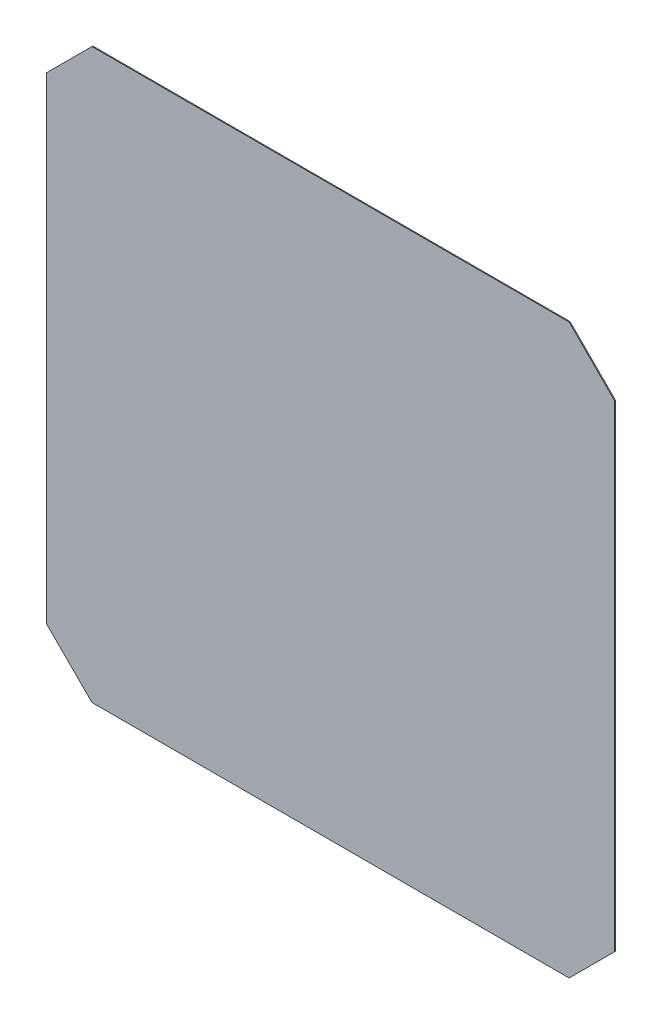
ISO-10303-21;
HEADER;
FILE_DESCRIPTION(('STEP AP214'),'2;1');
FILE_NAME('part.step','',(''),(''),'','','');
FILE_SCHEMA(('AUTOMOTIVE_DESIGN { 1 0 10303 214 1 1 1 1 }'));
ENDSEC;
DATA;
#1=APPLICATION_CONTEXT('core data for automotive mechanical design processes');
#2=APPLICATION_PROTOCOL_DEFINITION('international standard','automotive_design',2000,#1);
#3=PRODUCT_CONTEXT('',#1,'mechanical');
#4=PRODUCT('Part','Part','',(#3));
#5=PRODUCT_RELATED_PRODUCT_CATEGORY('part','',(#4));
#6=PRODUCT_DEFINITION_FORMATION('','',#4);
#7=PRODUCT_DEFINITION_CONTEXT('part definition',#1,'design');
#8=PRODUCT_DEFINITION('design','',#6,#7);
#9=PRODUCT_DEFINITION_SHAPE('','',#8);
#10=(LENGTH_UNIT() NAMED_UNIT(*) SI_UNIT(.MILLI.,.METRE.));
#11=(NAMED_UNIT(*) PLANE_ANGLE_UNIT() SI_UNIT($,.RADIAN.));
#12=(NAMED_UNIT(*) SI_UNIT($,.STERADIAN.) SOLID_ANGLE_UNIT());
#13=UNCERTAINTY_MEASURE_WITH_UNIT(LENGTH_MEASURE(1.E-05),#10,'distance_accuracy_value','');
#14=(GEOMETRIC_REPRESENTATION_CONTEXT(3) GLOBAL_UNCERTAINTY_ASSIGNED_CONTEXT((#13)) GLOBAL_UNIT_ASSIGNED_CONTEXT((#10,
#11,#12)) REPRESENTATION_CONTEXT('',''));
#15=CARTESIAN_POINT('',(0.,0.,0.));
#16=DIRECTION('',(0.,0.,1.));
#17=DIRECTION('',(1.,0.,0.));
#18=AXIS2_PLACEMENT_3D('',#15,#16,#17);
#19=CARTESIAN_POINT('',(-52.5,62.5,0.2));
#20=DIRECTION('',(0.,-1.,0.));
#21=DIRECTION('',(0.,0.,-1.));
#22=AXIS2_PLACEMENT_3D('',#19,#20,#21);
#23=PLANE('',#22);
#24=DIRECTION('',(-1.,0.,0.));
#25=VECTOR('',#24,1.);
#26=CARTESIAN_POINT('',(-52.5,62.5,0.));
#27=LINE('',#26,#25);
#28=CARTESIAN_POINT('',(52.5,62.5,0.));
#29=VERTEX_POINT('',#28);
#30=CARTESIAN_POINT('',(-52.5,62.5,0.));
#31=VERTEX_POINT('',#30);
#32=EDGE_CURVE('E150',#29,#31,#27,.T.);
#33=ORIENTED_EDGE('',*,*,#32,.T.);
#34=DIRECTION('',(0.,0.,-1.));
#35=VECTOR('',#34,1.);
#36=CARTESIAN_POINT('',(-52.5,62.5,0.2));
#37=LINE('',#36,#35);
#38=CARTESIAN_POINT('',(-52.5,62.5,0.2));
#39=VERTEX_POINT('',#38);
#40=EDGE_CURVE('E11',#39,#31,#37,.T.);
#41=ORIENTED_EDGE('',*,*,#40,.F.);
#42=DIRECTION('',(-1.,0.,0.));
#43=VECTOR('',#42,1.);
#44=CARTESIAN_POINT('',(-52.5,62.5,0.2));
#45=LINE('',#44,#43);
#46=CARTESIAN_POINT('',(52.5,62.5,0.2));
#47=VERTEX_POINT('',#46);
#48=EDGE_CURVE('E172',#47,#39,#45,.T.);
#49=ORIENTED_EDGE('',*,*,#48,.F.);
#50=DIRECTION('',(0.,0.,-1.));
#51=VECTOR('',#50,1.);
#52=CARTESIAN_POINT('',(52.5,62.5,0.2));
#53=LINE('',#52,#51);
#54=EDGE_CURVE('E146',#47,#29,#53,.T.);
#55=ORIENTED_EDGE('',*,*,#54,.T.);
#56=EDGE_LOOP('',(#33,#41,#49,#55));
#57=FACE_BOUND('',#56,.T.);
#58=ADVANCED_FACE('F49',(#57),#23,.F.);
#59=CARTESIAN_POINT('',(-62.5,52.5,0.2));
#60=DIRECTION('',(0.707106781186548,-0.707106781186548,0.));
#61=DIRECTION('',(0.707106781186548,0.707106781186548,0.));
#62=AXIS2_PLACEMENT_3D('',#59,#60,#61);
#63=PLANE('',#62);
#64=DIRECTION('',(-0.707106781186548,-0.707106781186548,0.));
#65=VECTOR('',#64,1.);
#66=CARTESIAN_POINT('',(-62.5,52.5,0.));
#67=LINE('',#66,#65);
#68=CARTESIAN_POINT('',(-62.5,52.5,0.));
#69=VERTEX_POINT('',#68);
#70=EDGE_CURVE('E154',#31,#69,#67,.T.);
#71=ORIENTED_EDGE('',*,*,#70,.T.);
#72=DIRECTION('',(0.,0.,-1.));
#73=VECTOR('',#72,1.);
#74=CARTESIAN_POINT('',(-62.5,52.5,0.2));
#75=LINE('',#74,#73);
#76=CARTESIAN_POINT('',(-62.5,52.5,0.2));
#77=VERTEX_POINT('',#76);
#78=EDGE_CURVE('E58',#77,#69,#75,.T.);
#79=ORIENTED_EDGE('',*,*,#78,.F.);
#80=DIRECTION('',(-0.707106781186548,-0.707106781186548,0.));
#81=VECTOR('',#80,1.);
#82=CARTESIAN_POINT('',(-62.5,52.5,0.2));
#83=LINE('',#82,#81);
#84=EDGE_CURVE('E109',#39,#77,#83,.T.);
#85=ORIENTED_EDGE('',*,*,#84,.F.);
#86=ORIENTED_EDGE('',*,*,#40,.T.);
#87=EDGE_LOOP('',(#71,#79,#85,#86));
#88=FACE_BOUND('',#87,.T.);
#89=ADVANCED_FACE('F218',(#88),#63,.F.);
#90=CARTESIAN_POINT('',(-62.5,52.5,0.2));
#91=DIRECTION('',(1.,0.,0.));
#92=DIRECTION('',(0.,0.,-1.));
#93=AXIS2_PLACEMENT_3D('',#90,#91,#92);
#94=PLANE('',#93);
#95=DIRECTION('',(0.,-1.,0.));
#96=VECTOR('',#95,1.);
#97=CARTESIAN_POINT('',(-62.5,52.5,0.));
#98=LINE('',#97,#96);
#99=CARTESIAN_POINT('',(-62.5,-52.5,0.));
#100=VERTEX_POINT('',#99);
#101=EDGE_CURVE('E157',#69,#100,#98,.T.);
#102=ORIENTED_EDGE('',*,*,#101,.T.);
#103=DIRECTION('',(0.,0.,-1.));
#104=VECTOR('',#103,1.);
#105=CARTESIAN_POINT('',(-62.5,-52.5,0.2));
#106=LINE('',#105,#104);
#107=CARTESIAN_POINT('',(-62.5,-52.5,0.2));
#108=VERTEX_POINT('',#107);
#109=EDGE_CURVE('E183',#108,#100,#106,.T.);
#110=ORIENTED_EDGE('',*,*,#109,.F.);
#111=DIRECTION('',(0.,-1.,0.));
#112=VECTOR('',#111,1.);
#113=CARTESIAN_POINT('',(-62.5,52.5,0.2));
#114=LINE('',#113,#112);
#115=EDGE_CURVE('E193',#77,#108,#114,.T.);
#116=ORIENTED_EDGE('',*,*,#115,.F.);
#117=ORIENTED_EDGE('',*,*,#78,.T.);
#118=EDGE_LOOP('',(#102,#110,#116,#117));
#119=FACE_BOUND('',#118,.T.);
#120=ADVANCED_FACE('F191',(#119),#94,.F.);
#121=CARTESIAN_POINT('',(-62.5,-52.5,0.2));
#122=DIRECTION('',(0.707106781186548,0.707106781186548,0.));
#123=DIRECTION('',(-0.707106781186548,0.707106781186548,0.));
#124=AXIS2_PLACEMENT_3D('',#121,#122,#123);
#125=PLANE('',#124);
#126=DIRECTION('',(0.707106781186548,-0.707106781186548,0.));
#127=VECTOR('',#126,1.);
#128=CARTESIAN_POINT('',(-62.5,-52.5,0.));
#129=LINE('',#128,#127);
#130=CARTESIAN_POINT('',(-52.5,-62.5,0.));
#131=VERTEX_POINT('',#130);
#132=EDGE_CURVE('E160',#100,#131,#129,.T.);
#133=ORIENTED_EDGE('',*,*,#132,.T.);
#134=DIRECTION('',(0.,0.,-1.));
#135=VECTOR('',#134,1.);
#136=CARTESIAN_POINT('',(-52.5,-62.5,0.2));
#137=LINE('',#136,#135);
#138=CARTESIAN_POINT('',(-52.5,-62.5,0.2));
#139=VERTEX_POINT('',#138);
#140=EDGE_CURVE('E179',#139,#131,#137,.T.);
#141=ORIENTED_EDGE('',*,*,#140,.F.);
#142=DIRECTION('',(0.707106781186548,-0.707106781186548,0.));
#143=VECTOR('',#142,1.);
#144=CARTESIAN_POINT('',(-62.5,-52.5,0.2));
#145=LINE('',#144,#143);
#146=EDGE_CURVE('E206',#108,#139,#145,.T.);
#147=ORIENTED_EDGE('',*,*,#146,.F.);
#148=ORIENTED_EDGE('',*,*,#109,.T.);
#149=EDGE_LOOP('',(#133,#141,#147,#148));
#150=FACE_BOUND('',#149,.T.);
#151=ADVANCED_FACE('F201',(#150),#125,.F.);
#152=CARTESIAN_POINT('',(-52.5,-62.5,0.2));
#153=DIRECTION('',(0.,1.,0.));
#154=DIRECTION('',(0.,0.,1.));
#155=AXIS2_PLACEMENT_3D('',#152,#153,#154);
#156=PLANE('',#155);
#157=DIRECTION('',(1.,0.,0.));
#158=VECTOR('',#157,1.);
#159=CARTESIAN_POINT('',(-52.5,-62.5,0.));
#160=LINE('',#159,#158);
#161=CARTESIAN_POINT('',(52.5,-62.5,0.));
#162=VERTEX_POINT('',#161);
#163=EDGE_CURVE('E163',#131,#162,#160,.T.);
#164=ORIENTED_EDGE('',*,*,#163,.T.);
#165=DIRECTION('',(0.,0.,-1.));
#166=VECTOR('',#165,1.);
#167=CARTESIAN_POINT('',(52.5,-62.5,0.2));
#168=LINE('',#167,#166);
#169=CARTESIAN_POINT('',(52.5,-62.5,0.2));
#170=VERTEX_POINT('',#169);
#171=EDGE_CURVE('E139',#170,#162,#168,.T.);
#172=ORIENTED_EDGE('',*,*,#171,.F.);
#173=DIRECTION('',(1.,0.,0.));
#174=VECTOR('',#173,1.);
#175=CARTESIAN_POINT('',(-52.5,-62.5,0.2));
#176=LINE('',#175,#174);
#177=EDGE_CURVE('E128',#139,#170,#176,.T.);
#178=ORIENTED_EDGE('',*,*,#177,.F.);
#179=ORIENTED_EDGE('',*,*,#140,.T.);
#180=EDGE_LOOP('',(#164,#172,#178,#179));
#181=FACE_BOUND('',#180,.T.);
#182=ADVANCED_FACE('F204',(#181),#156,.F.);
#183=CARTESIAN_POINT('',(52.5,-62.5,0.2));
#184=DIRECTION('',(-0.707106781186548,0.707106781186548,0.));
#185=DIRECTION('',(-0.707106781186548,-0.707106781186548,0.));
#186=AXIS2_PLACEMENT_3D('',#183,#184,#185);
#187=PLANE('',#186);
#188=DIRECTION('',(0.707106781186548,0.707106781186548,0.));
#189=VECTOR('',#188,1.);
#190=CARTESIAN_POINT('',(52.5,-62.5,0.));
#191=LINE('',#190,#189);
#192=CARTESIAN_POINT('',(62.5,-52.5,0.));
#193=VERTEX_POINT('',#192);
#194=EDGE_CURVE('E137',#162,#193,#191,.T.);
#195=ORIENTED_EDGE('',*,*,#194,.T.);
#196=DIRECTION('',(0.,0.,-1.));
#197=VECTOR('',#196,1.);
#198=CARTESIAN_POINT('',(62.5,-52.5,0.2));
#199=LINE('',#198,#197);
#200=CARTESIAN_POINT('',(62.5,-52.5,0.2));
#201=VERTEX_POINT('',#200);
#202=EDGE_CURVE('E134',#201,#193,#199,.T.);
#203=ORIENTED_EDGE('',*,*,#202,.F.);
#204=DIRECTION('',(0.707106781186548,0.707106781186548,0.));
#205=VECTOR('',#204,1.);
#206=CARTESIAN_POINT('',(52.5,-62.5,0.2));
#207=LINE('',#206,#205);
#208=EDGE_CURVE('E122',#170,#201,#207,.T.);
#209=ORIENTED_EDGE('',*,*,#208,.F.);
#210=ORIENTED_EDGE('',*,*,#171,.T.);
#211=EDGE_LOOP('',(#195,#203,#209,#210));
#212=FACE_BOUND('',#211,.T.);
#213=ADVANCED_FACE('F135',(#212),#187,.F.);
#214=CARTESIAN_POINT('',(62.5,52.5,0.2));
#215=DIRECTION('',(-1.,0.,0.));
#216=DIRECTION('',(0.,0.,1.));
#217=AXIS2_PLACEMENT_3D('',#214,#215,#216);
#218=PLANE('',#217);
#219=DIRECTION('',(0.,1.,0.));
#220=VECTOR('',#219,1.);
#221=CARTESIAN_POINT('',(62.5,52.5,0.));
#222=LINE('',#221,#220);
#223=CARTESIAN_POINT('',(62.5,52.5,0.));
#224=VERTEX_POINT('',#223);
#225=EDGE_CURVE('E95',#193,#224,#222,.T.);
#226=ORIENTED_EDGE('',*,*,#225,.T.);
#227=DIRECTION('',(0.,0.,-1.));
#228=VECTOR('',#227,1.);
#229=CARTESIAN_POINT('',(62.5,52.5,0.2));
#230=LINE('',#229,#228);
#231=CARTESIAN_POINT('',(62.5,52.5,0.2));
#232=VERTEX_POINT('',#231);
#233=EDGE_CURVE('E140',#232,#224,#230,.T.);
#234=ORIENTED_EDGE('',*,*,#233,.F.);
#235=DIRECTION('',(0.,1.,0.));
#236=VECTOR('',#235,1.);
#237=CARTESIAN_POINT('',(62.5,52.5,0.2));
#238=LINE('',#237,#236);
#239=EDGE_CURVE('E126',#201,#232,#238,.T.);
#240=ORIENTED_EDGE('',*,*,#239,.F.);
#241=ORIENTED_EDGE('',*,*,#202,.T.);
#242=EDGE_LOOP('',(#226,#234,#240,#241));
#243=FACE_BOUND('',#242,.T.);
#244=ADVANCED_FACE('F142',(#243),#218,.F.);
#245=CARTESIAN_POINT('',(52.5,62.5,0.2));
#246=DIRECTION('',(-0.707106781186548,-0.707106781186548,0.));
#247=DIRECTION('',(0.707106781186548,-0.707106781186548,0.));
#248=AXIS2_PLACEMENT_3D('',#245,#246,#247);
#249=PLANE('',#248);
#250=DIRECTION('',(-0.707106781186548,0.707106781186548,0.));
#251=VECTOR('',#250,1.);
#252=CARTESIAN_POINT('',(52.5,62.5,0.));
#253=LINE('',#252,#251);
#254=EDGE_CURVE('E101',#224,#29,#253,.T.);
#255=ORIENTED_EDGE('',*,*,#254,.T.);
#256=ORIENTED_EDGE('',*,*,#54,.F.);
#257=DIRECTION('',(-0.707106781186548,0.707106781186548,0.));
#258=VECTOR('',#257,1.);
#259=CARTESIAN_POINT('',(52.5,62.5,0.2));
#260=LINE('',#259,#258);
#261=EDGE_CURVE('E66',#232,#47,#260,.T.);
#262=ORIENTED_EDGE('',*,*,#261,.F.);
#263=ORIENTED_EDGE('',*,*,#233,.T.);
#264=EDGE_LOOP('',(#255,#256,#262,#263));
#265=FACE_BOUND('',#264,.T.);
#266=ADVANCED_FACE('F234',(#265),#249,.F.);
#267=CARTESIAN_POINT('',(0.,0.,0.2));
#268=DIRECTION('',(0.,0.,-1.));
#269=DIRECTION('',(-1.,0.,0.));
#270=AXIS2_PLACEMENT_3D('',#267,#268,#269);
#271=PLANE('',#270);
#272=ORIENTED_EDGE('',*,*,#48,.T.);
#273=ORIENTED_EDGE('',*,*,#84,.T.);
#274=ORIENTED_EDGE('',*,*,#115,.T.);
#275=ORIENTED_EDGE('',*,*,#146,.T.);
#276=ORIENTED_EDGE('',*,*,#177,.T.);
#277=ORIENTED_EDGE('',*,*,#208,.T.);
#278=ORIENTED_EDGE('',*,*,#239,.T.);
#279=ORIENTED_EDGE('',*,*,#261,.T.);
#280=EDGE_LOOP('',(#272,#273,#274,#275,#276,#277,#278,#279));
#281=FACE_BOUND('',#280,.T.);
#282=ADVANCED_FACE('F124',(#281),#271,.F.);
#283=CARTESIAN_POINT('',(0.,0.,0.));
#284=DIRECTION('',(0.,0.,-1.));
#285=DIRECTION('',(-1.,0.,0.));
#286=AXIS2_PLACEMENT_3D('',#283,#284,#285);
#287=PLANE('',#286);
#288=ORIENTED_EDGE('',*,*,#32,.F.);
#289=ORIENTED_EDGE('',*,*,#254,.F.);
#290=ORIENTED_EDGE('',*,*,#225,.F.);
#291=ORIENTED_EDGE('',*,*,#194,.F.);
#292=ORIENTED_EDGE('',*,*,#163,.F.);
#293=ORIENTED_EDGE('',*,*,#132,.F.);
#294=ORIENTED_EDGE('',*,*,#101,.F.);
#295=ORIENTED_EDGE('',*,*,#70,.F.);
#296=EDGE_LOOP('',(#288,#289,#290,#291,#292,#293,#294,#295));
#297=FACE_BOUND('',#296,.T.);
#298=ADVANCED_FACE('F197',(#297),#287,.T.);
#299=CLOSED_SHELL('',(#58,#89,#120,#151,#182,#213,#244,#266,#282,#298));
#300=MANIFOLD_SOLID_BREP('B2',#299);
#301=ADVANCED_BREP_SHAPE_REPRESENTATION('',(#18,#300),#14);
#302=SHAPE_DEFINITION_REPRESENTATION(#9,#301);
ENDSEC;
END-ISO-10303-21;
